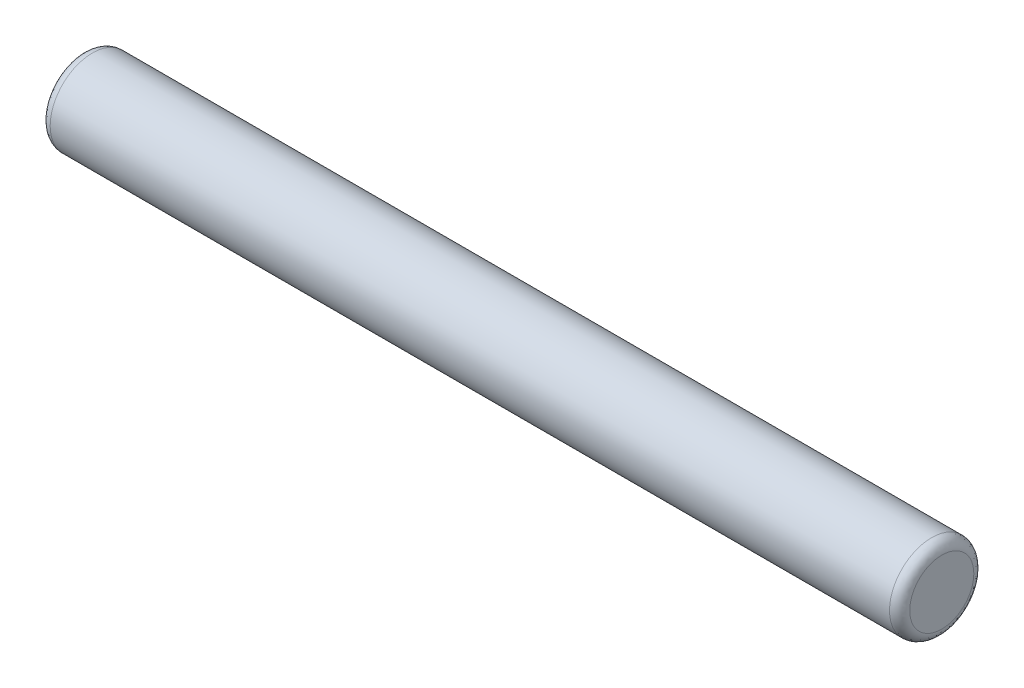
ISO-10303-21;
HEADER;
FILE_DESCRIPTION(('STEP AP214'),'2;1');
FILE_NAME('part.step','',(''),(''),'','','');
FILE_SCHEMA(('AUTOMOTIVE_DESIGN { 1 0 10303 214 1 1 1 1 }'));
ENDSEC;
DATA;
#1=APPLICATION_CONTEXT('core data for automotive mechanical design processes');
#2=APPLICATION_PROTOCOL_DEFINITION('international standard','automotive_design',2000,#1);
#3=PRODUCT_CONTEXT('',#1,'mechanical');
#4=PRODUCT('Part','Part','',(#3));
#5=PRODUCT_RELATED_PRODUCT_CATEGORY('part','',(#4));
#6=PRODUCT_DEFINITION_FORMATION('','',#4);
#7=PRODUCT_DEFINITION_CONTEXT('part definition',#1,'design');
#8=PRODUCT_DEFINITION('design','',#6,#7);
#9=PRODUCT_DEFINITION_SHAPE('','',#8);
#10=(LENGTH_UNIT() NAMED_UNIT(*) SI_UNIT(.MILLI.,.METRE.));
#11=(NAMED_UNIT(*) PLANE_ANGLE_UNIT() SI_UNIT($,.RADIAN.));
#12=(NAMED_UNIT(*) SI_UNIT($,.STERADIAN.) SOLID_ANGLE_UNIT());
#13=UNCERTAINTY_MEASURE_WITH_UNIT(LENGTH_MEASURE(1.E-05),#10,'distance_accuracy_value','');
#14=(GEOMETRIC_REPRESENTATION_CONTEXT(3) GLOBAL_UNCERTAINTY_ASSIGNED_CONTEXT((#13)) GLOBAL_UNIT_ASSIGNED_CONTEXT((#10,
#11,#12)) REPRESENTATION_CONTEXT('',''));
#15=CARTESIAN_POINT('',(0.,0.,0.));
#16=DIRECTION('',(0.,0.,1.));
#17=DIRECTION('',(1.,0.,0.));
#18=AXIS2_PLACEMENT_3D('',#15,#16,#17);
#19=CARTESIAN_POINT('',(0.,0.,0.));
#20=DIRECTION('',(1.,0.,0.));
#21=DIRECTION('',(0.,0.,-1.));
#22=AXIS2_PLACEMENT_3D('',#19,#20,#21);
#23=PLANE('',#22);
#24=CARTESIAN_POINT('',(0.,0.,0.));
#25=DIRECTION('',(1.,0.,0.));
#26=DIRECTION('',(0.,0.,1.));
#27=AXIS2_PLACEMENT_3D('',#24,#25,#26);
#28=CIRCLE('',#27,1.2065);
#29=CARTESIAN_POINT('',(0.,0.,1.2065));
#30=VERTEX_POINT('',#29);
#31=CARTESIAN_POINT('',(0.,0.,-1.2065));
#32=VERTEX_POINT('',#31);
#33=EDGE_CURVE('E46',#30,#32,#28,.T.);
#34=ORIENTED_EDGE('',*,*,#33,.F.);
#35=CARTESIAN_POINT('',(0.,0.,0.));
#36=DIRECTION('',(1.,0.,0.));
#37=DIRECTION('',(0.,0.,-1.));
#38=AXIS2_PLACEMENT_3D('',#35,#36,#37);
#39=CIRCLE('',#38,1.2065);
#40=EDGE_CURVE('E43',#32,#30,#39,.T.);
#41=ORIENTED_EDGE('',*,*,#40,.F.);
#42=EDGE_LOOP('',(#34,#41));
#43=FACE_BOUND('',#42,.T.);
#44=ADVANCED_FACE('F17',(#43),#23,.F.);
#45=CARTESIAN_POINT('',(0.381,0.,-1.5875));
#46=CARTESIAN_POINT('',(0.157815367264149,0.,-1.5875));
#47=CARTESIAN_POINT('',(0.,0.,-1.42968463273585));
#48=CARTESIAN_POINT('',(0.,0.,-1.2065));
#49=(BOUNDED_CURVE() B_SPLINE_CURVE(3,(#45,#46,#47,#48),.UNSPECIFIED.,.F.,
.F.) B_SPLINE_CURVE_WITH_KNOTS((4,4),(0.,1.),
.UNSPECIFIED.) CURVE() GEOMETRIC_REPRESENTATION_ITEM() RATIONAL_B_SPLINE_CURVE((1.,
0.804737854124365,0.804737854124365,1.)) REPRESENTATION_ITEM(''));
#50=CARTESIAN_POINT('',(0.381,0.,0.));
#51=DIRECTION('',(1.,0.,0.));
#52=AXIS1_PLACEMENT('',#50,#51);
#53=SURFACE_OF_REVOLUTION('',#49,#52);
#54=CARTESIAN_POINT('',(0.380999999999999,0.,0.));
#55=DIRECTION('',(-1.,0.,0.));
#56=DIRECTION('',(0.,0.,1.));
#57=AXIS2_PLACEMENT_3D('',#54,#55,#56);
#58=CIRCLE('',#57,1.5875);
#59=CARTESIAN_POINT('',(0.381,0.,1.5875));
#60=VERTEX_POINT('',#59);
#61=EDGE_CURVE('E53',#60,#60,#58,.F.);
#62=ORIENTED_EDGE('',*,*,#61,.F.);
#63=EDGE_LOOP('',(#62));
#64=FACE_BOUND('',#63,.T.);
#65=ORIENTED_EDGE('',*,*,#40,.T.);
#66=ORIENTED_EDGE('',*,*,#33,.T.);
#67=EDGE_LOOP('',(#65,#66));
#68=FACE_BOUND('',#67,.T.);
#69=ADVANCED_FACE('F52',(#64,#68),#53,.F.);
#70=CARTESIAN_POINT('',(0.381,0.,0.));
#71=DIRECTION('',(-1.,0.,0.));
#72=DIRECTION('',(0.,-1.,0.));
#73=AXIS2_PLACEMENT_3D('',#70,#71,#72);
#74=CYLINDRICAL_SURFACE('',#73,1.5875);
#75=ORIENTED_EDGE('',*,*,#61,.T.);
#76=EDGE_LOOP('',(#75));
#77=FACE_BOUND('',#76,.T.);
#78=CARTESIAN_POINT('',(31.99384,0.,0.));
#79=DIRECTION('',(1.,0.,0.));
#80=DIRECTION('',(0.,0.,-1.));
#81=AXIS2_PLACEMENT_3D('',#78,#79,#80);
#82=CIRCLE('',#81,1.5875);
#83=CARTESIAN_POINT('',(31.99384,0.,-1.5875));
#84=VERTEX_POINT('',#83);
#85=EDGE_CURVE('E28',#84,#84,#82,.T.);
#86=ORIENTED_EDGE('',*,*,#85,.F.);
#87=EDGE_LOOP('',(#86));
#88=FACE_BOUND('',#87,.T.);
#89=ADVANCED_FACE('F71',(#77,#88),#74,.T.);
#90=CARTESIAN_POINT('',(32.37484,0.,0.));
#91=DIRECTION('',(1.,0.,0.));
#92=DIRECTION('',(0.,0.,-1.));
#93=AXIS2_PLACEMENT_3D('',#90,#91,#92);
#94=PLANE('',#93);
#95=CARTESIAN_POINT('',(32.37484,0.,0.));
#96=DIRECTION('',(-1.,0.,0.));
#97=DIRECTION('',(0.,0.,1.));
#98=AXIS2_PLACEMENT_3D('',#95,#96,#97);
#99=CIRCLE('',#98,1.2065);
#100=CARTESIAN_POINT('',(32.37484,0.,1.2065));
#101=VERTEX_POINT('',#100);
#102=CARTESIAN_POINT('',(32.37484,0.,-1.2065));
#103=VERTEX_POINT('',#102);
#104=EDGE_CURVE('E11',#101,#103,#99,.T.);
#105=ORIENTED_EDGE('',*,*,#104,.F.);
#106=CARTESIAN_POINT('',(32.37484,0.,0.));
#107=DIRECTION('',(-1.,0.,0.));
#108=DIRECTION('',(0.,0.,-1.));
#109=AXIS2_PLACEMENT_3D('',#106,#107,#108);
#110=CIRCLE('',#109,1.2065);
#111=EDGE_CURVE('E35',#101,#103,#110,.F.);
#112=ORIENTED_EDGE('',*,*,#111,.T.);
#113=EDGE_LOOP('',(#105,#112));
#114=FACE_BOUND('',#113,.T.);
#115=ADVANCED_FACE('F91',(#114),#94,.T.);
#116=CARTESIAN_POINT('',(32.37484,0.,-1.2065));
#117=CARTESIAN_POINT('',(32.37484,0.,-1.42968463273585));
#118=CARTESIAN_POINT('',(32.2170246327358,0.,-1.5875));
#119=CARTESIAN_POINT('',(31.99384,0.,-1.5875));
#120=(BOUNDED_CURVE() B_SPLINE_CURVE(3,(#116,#117,#118,#119),.UNSPECIFIED.,.F.,
.F.) B_SPLINE_CURVE_WITH_KNOTS((4,4),(0.,1.),
.UNSPECIFIED.) CURVE() GEOMETRIC_REPRESENTATION_ITEM() RATIONAL_B_SPLINE_CURVE((1.,
0.804737854124365,0.804737854124365,1.)) REPRESENTATION_ITEM(''));
#121=CARTESIAN_POINT('',(31.99384,0.,0.));
#122=DIRECTION('',(1.,0.,0.));
#123=AXIS1_PLACEMENT('',#121,#122);
#124=SURFACE_OF_REVOLUTION('',#120,#123);
#125=ORIENTED_EDGE('',*,*,#85,.T.);
#126=EDGE_LOOP('',(#125));
#127=FACE_BOUND('',#126,.T.);
#128=ORIENTED_EDGE('',*,*,#104,.T.);
#129=ORIENTED_EDGE('',*,*,#111,.F.);
#130=EDGE_LOOP('',(#128,#129));
#131=FACE_BOUND('',#130,.T.);
#132=ADVANCED_FACE('F96',(#127,#131),#124,.F.);
#133=CLOSED_SHELL('',(#44,#69,#89,#115,#132));
#134=MANIFOLD_SOLID_BREP('B1',#133);
#135=ADVANCED_BREP_SHAPE_REPRESENTATION('',(#18,#134),#14);
#136=SHAPE_DEFINITION_REPRESENTATION(#9,#135);
ENDSEC;
END-ISO-10303-21;
